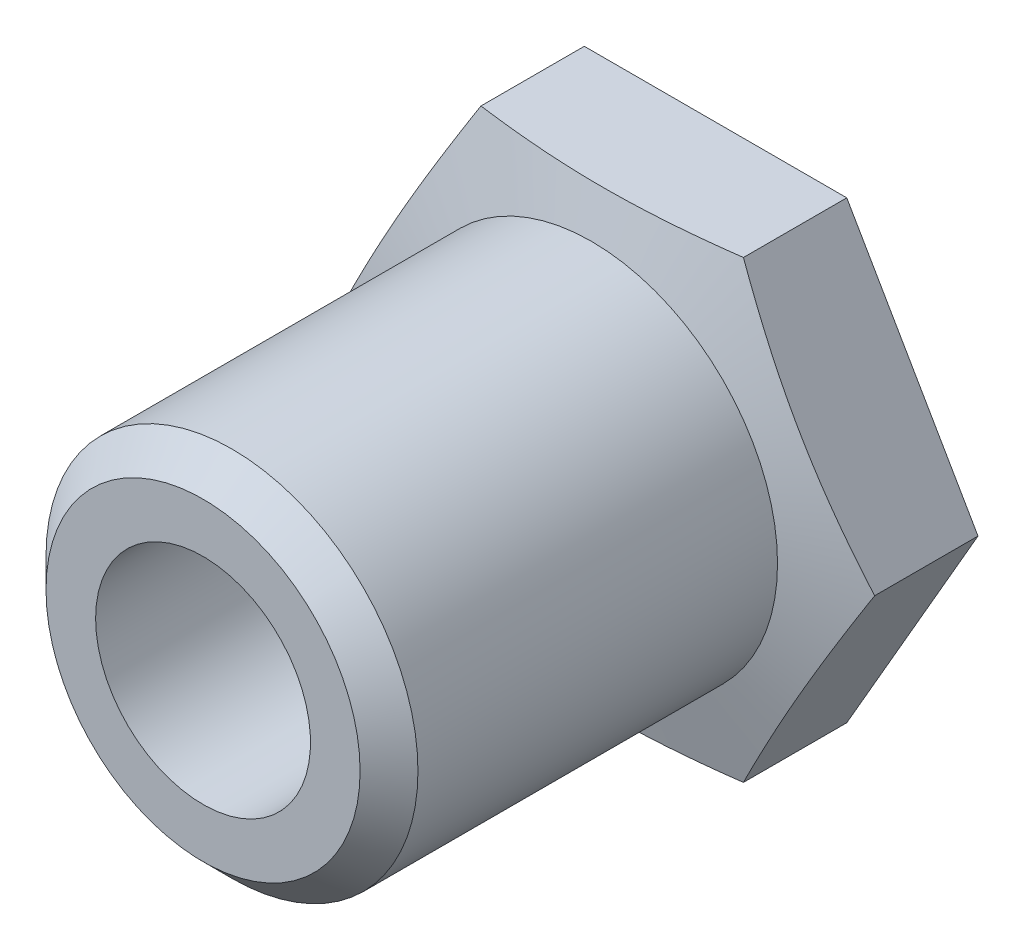
ISO-10303-21;
HEADER;
FILE_DESCRIPTION(('STEP AP214'),'2;1');
FILE_NAME('part.step','',(''),(''),'','','');
FILE_SCHEMA(('AUTOMOTIVE_DESIGN { 1 0 10303 214 1 1 1 1 }'));
ENDSEC;
DATA;
#1=APPLICATION_CONTEXT('core data for automotive mechanical design processes');
#2=APPLICATION_PROTOCOL_DEFINITION('international standard','automotive_design',2000,#1);
#3=PRODUCT_CONTEXT('',#1,'mechanical');
#4=PRODUCT('Part','Part','',(#3));
#5=PRODUCT_RELATED_PRODUCT_CATEGORY('part','',(#4));
#6=PRODUCT_DEFINITION_FORMATION('','',#4);
#7=PRODUCT_DEFINITION_CONTEXT('part definition',#1,'design');
#8=PRODUCT_DEFINITION('design','',#6,#7);
#9=PRODUCT_DEFINITION_SHAPE('','',#8);
#10=(LENGTH_UNIT() NAMED_UNIT(*) SI_UNIT(.MILLI.,.METRE.));
#11=(NAMED_UNIT(*) PLANE_ANGLE_UNIT() SI_UNIT($,.RADIAN.));
#12=(NAMED_UNIT(*) SI_UNIT($,.STERADIAN.) SOLID_ANGLE_UNIT());
#13=UNCERTAINTY_MEASURE_WITH_UNIT(LENGTH_MEASURE(1.E-05),#10,'distance_accuracy_value','');
#14=(GEOMETRIC_REPRESENTATION_CONTEXT(3) GLOBAL_UNCERTAINTY_ASSIGNED_CONTEXT((#13)) GLOBAL_UNIT_ASSIGNED_CONTEXT((#10,
#11,#12)) REPRESENTATION_CONTEXT('',''));
#15=CARTESIAN_POINT('',(0.,0.,0.));
#16=DIRECTION('',(0.,0.,1.));
#17=DIRECTION('',(1.,0.,0.));
#18=AXIS2_PLACEMENT_3D('',#15,#16,#17);
#19=CARTESIAN_POINT('',(0.,0.,12.4));
#20=DIRECTION('',(0.,0.,-1.));
#21=DIRECTION('',(-1.,0.,0.));
#22=AXIS2_PLACEMENT_3D('',#19,#20,#21);
#23=CYLINDRICAL_SURFACE('',#22,4.5);
#24=CARTESIAN_POINT('',(0.,0.,11.7));
#25=DIRECTION('',(0.,0.,1.));
#26=DIRECTION('',(1.,0.,0.));
#27=AXIS2_PLACEMENT_3D('',#24,#25,#26);
#28=CIRCLE('',#27,4.5);
#29=CARTESIAN_POINT('',(4.5,0.,11.7));
#30=VERTEX_POINT('',#29);
#31=EDGE_CURVE('E11',#30,#30,#28,.F.);
#32=ORIENTED_EDGE('',*,*,#31,.T.);
#33=EDGE_LOOP('',(#32));
#34=FACE_BOUND('',#33,.T.);
#35=CARTESIAN_POINT('',(0.,0.,3.));
#36=DIRECTION('',(0.,0.,1.));
#37=DIRECTION('',(1.,0.,0.));
#38=AXIS2_PLACEMENT_3D('',#35,#36,#37);
#39=CIRCLE('',#38,4.5);
#40=CARTESIAN_POINT('',(4.5,0.,3.));
#41=VERTEX_POINT('',#40);
#42=EDGE_CURVE('E225',#41,#41,#39,.T.);
#43=ORIENTED_EDGE('',*,*,#42,.T.);
#44=EDGE_LOOP('',(#43));
#45=FACE_BOUND('',#44,.T.);
#46=ADVANCED_FACE('F35',(#34,#45),#23,.T.);
#47=CARTESIAN_POINT('',(0.,0.,12.4));
#48=DIRECTION('',(0.,0.,1.));
#49=DIRECTION('',(1.,0.,0.));
#50=AXIS2_PLACEMENT_3D('',#47,#48,#49);
#51=PLANE('',#50);
#52=CARTESIAN_POINT('',(0.,0.,12.4));
#53=DIRECTION('',(0.,0.,1.));
#54=DIRECTION('',(1.,0.,0.));
#55=AXIS2_PLACEMENT_3D('',#52,#53,#54);
#56=CIRCLE('',#55,3.8);
#57=CARTESIAN_POINT('',(3.8,0.,12.4));
#58=VERTEX_POINT('',#57);
#59=EDGE_CURVE('E43',#58,#58,#56,.T.);
#60=ORIENTED_EDGE('',*,*,#59,.T.);
#61=EDGE_LOOP('',(#60));
#62=FACE_BOUND('',#61,.T.);
#63=CARTESIAN_POINT('',(0.,0.,12.4));
#64=DIRECTION('',(0.,0.,-1.));
#65=DIRECTION('',(-1.,0.,0.));
#66=AXIS2_PLACEMENT_3D('',#63,#64,#65);
#67=CIRCLE('',#66,2.6);
#68=CARTESIAN_POINT('',(-2.6,0.,12.4));
#69=VERTEX_POINT('',#68);
#70=EDGE_CURVE('E133',#69,#69,#67,.T.);
#71=ORIENTED_EDGE('',*,*,#70,.T.);
#72=EDGE_LOOP('',(#71));
#73=FACE_BOUND('',#72,.T.);
#74=ADVANCED_FACE('F192',(#62,#73),#51,.T.);
#75=CARTESIAN_POINT('',(0.,0.,12.4));
#76=DIRECTION('',(0.,0.,-1.));
#77=DIRECTION('',(-1.,0.,0.));
#78=AXIS2_PLACEMENT_3D('',#75,#76,#77);
#79=CYLINDRICAL_SURFACE('',#78,2.6);
#80=ORIENTED_EDGE('',*,*,#70,.F.);
#81=EDGE_LOOP('',(#80));
#82=FACE_BOUND('',#81,.T.);
#83=CARTESIAN_POINT('',(0.,0.,2.));
#84=DIRECTION('',(0.,0.,-1.));
#85=DIRECTION('',(-1.,0.,0.));
#86=AXIS2_PLACEMENT_3D('',#83,#84,#85);
#87=CIRCLE('',#86,2.6);
#88=CARTESIAN_POINT('',(-2.6,0.,2.));
#89=VERTEX_POINT('',#88);
#90=EDGE_CURVE('E94',#89,#89,#87,.T.);
#91=ORIENTED_EDGE('',*,*,#90,.T.);
#92=EDGE_LOOP('',(#91));
#93=FACE_BOUND('',#92,.T.);
#94=ADVANCED_FACE('F198',(#82,#93),#79,.F.);
#95=CARTESIAN_POINT('',(0.,0.,2.));
#96=DIRECTION('',(0.,0.,-1.));
#97=DIRECTION('',(-1.,0.,0.));
#98=AXIS2_PLACEMENT_3D('',#95,#96,#97);
#99=PLANE('',#98);
#100=ORIENTED_EDGE('',*,*,#90,.F.);
#101=EDGE_LOOP('',(#100));
#102=FACE_BOUND('',#101,.T.);
#103=ADVANCED_FACE('F151',(#102),#99,.F.);
#104=CARTESIAN_POINT('',(0.,0.,3.));
#105=DIRECTION('',(0.,0.,-1.));
#106=DIRECTION('',(-1.,0.,0.));
#107=AXIS2_PLACEMENT_3D('',#104,#105,#106);
#108=CONICAL_SURFACE('',#107,4.5,1.30694868141892);
#109=ORIENTED_EDGE('',*,*,#42,.F.);
#110=EDGE_LOOP('',(#109));
#111=FACE_BOUND('',#110,.T.);
#112=CARTESIAN_POINT('',(3.17531101048908,-5.50020000000003,2.49996880540881));
#113=CARTESIAN_POINT('',(3.30718086409633,-5.27179471356559,2.53560827067485));
#114=CARTESIAN_POINT('',(3.43929368472072,-5.04296859591292,2.56796434186975));
#115=CARTESIAN_POINT('',(3.70399356498637,-4.58449495453541,2.62481250126896));
#116=CARTESIAN_POINT('',(3.83658079778817,-4.35484713088773,2.64930133971248));
#117=CARTESIAN_POINT('',(4.10141249887106,-3.89614516915726,2.68898192793889));
#118=CARTESIAN_POINT('',(4.23365511710285,-3.66709423545387,2.70422177046429));
#119=CARTESIAN_POINT('',(4.49831175641597,-3.20869548960311,2.7246569593401));
#120=CARTESIAN_POINT('',(4.63072573861518,-2.97934774480156,2.7298542831265));
#121=CARTESIAN_POINT('',(4.8955537030136,-2.52065225519845,2.7298542831265));
#122=CARTESIAN_POINT('',(5.02796768521281,-2.2913045103969,2.7246569593401));
#123=CARTESIAN_POINT('',(5.29262432452594,-1.83290576454614,2.70422177046429));
#124=CARTESIAN_POINT('',(5.42486694275772,-1.60385483084275,2.68898192793889));
#125=CARTESIAN_POINT('',(5.68969864384062,-1.14515286911228,2.64930133971248));
#126=CARTESIAN_POINT('',(5.82228587664242,-0.915505045464597,2.62481250126896));
#127=CARTESIAN_POINT('',(6.08698575690807,-0.457031404087092,2.56796434186976));
#128=CARTESIAN_POINT('',(6.21909857753245,-0.228205286434417,2.53560827067485));
#129=CARTESIAN_POINT('',(6.35096843113971,0.000200000000016106,2.49996880540882));
#130=B_SPLINE_CURVE_WITH_KNOTS('',3,(#112,#113,#114,#115,#116,#117,#118,#119,#120,#121,#122,
#123,#124,#125,#126,#127,#128,#129),.UNSPECIFIED.,.F.,.F.,(4,2,2,2,2,2,2,2,4),(0.,
0.79845302802241,1.59723545457054,2.39182798445062,3.18626403804335,3.98070009163608,
4.77529262151615,5.57407504806429,6.3725280760867),.UNSPECIFIED.);
#131=CARTESIAN_POINT('',(3.17542648054298,-5.50000000000003,2.5));
#132=VERTEX_POINT('',#131);
#133=CARTESIAN_POINT('',(6.35085296108592,0.,2.5));
#134=VERTEX_POINT('',#133);
#135=EDGE_CURVE('E87',#132,#134,#130,.T.);
#136=ORIENTED_EDGE('',*,*,#135,.T.);
#137=CARTESIAN_POINT('',(6.35096843113971,-0.000199999999984875,2.49996880540882));
#138=CARTESIAN_POINT('',(6.21909857753245,0.228205286434449,2.53560827067485));
#139=CARTESIAN_POINT('',(6.08698575690806,0.457031404087123,2.56796434186976));
#140=CARTESIAN_POINT('',(5.82228587664241,0.915505045464627,2.62481250126896));
#141=CARTESIAN_POINT('',(5.68969864384061,1.14515286911231,2.64930133971248));
#142=CARTESIAN_POINT('',(5.42486694275772,1.60385483084277,2.68898192793889));
#143=CARTESIAN_POINT('',(5.29262432452593,1.83290576454616,2.70422177046429));
#144=CARTESIAN_POINT('',(5.0279676852128,2.29130451039693,2.7246569593401));
#145=CARTESIAN_POINT('',(4.89555370301359,2.52065225519848,2.7298542831265));
#146=CARTESIAN_POINT('',(4.63072573861517,2.97934774480158,2.7298542831265));
#147=CARTESIAN_POINT('',(4.49831175641596,3.20869548960314,2.7246569593401));
#148=CARTESIAN_POINT('',(4.23365511710284,3.6670942354539,2.70422177046428));
#149=CARTESIAN_POINT('',(4.10141249887105,3.89614516915729,2.68898192793888));
#150=CARTESIAN_POINT('',(3.83658079778815,4.35484713088776,2.64930133971247));
#151=CARTESIAN_POINT('',(3.70399356498635,4.58449495453544,2.62481250126896));
#152=CARTESIAN_POINT('',(3.4392936847207,5.04296859591294,2.56796434186975));
#153=CARTESIAN_POINT('',(3.30718086409631,5.27179471356561,2.53560827067484));
#154=CARTESIAN_POINT('',(3.17531101048906,5.50020000000005,2.49996880540881));
#155=B_SPLINE_CURVE_WITH_KNOTS('',3,(#137,#138,#139,#140,#141,#142,#143,#144,#145,#146,#147,
#148,#149,#150,#151,#152,#153,#154),.UNSPECIFIED.,.F.,.F.,(4,2,2,2,2,2,2,2,4),(0.,
0.798453028022411,1.59723545457054,2.39182798445062,3.18626403804335,3.98070009163608,
4.77529262151615,5.57407504806429,6.3725280760867),.UNSPECIFIED.);
#156=CARTESIAN_POINT('',(3.17542648054294,5.50000000000005,2.5));
#157=VERTEX_POINT('',#156);
#158=EDGE_CURVE('E90',#134,#157,#155,.T.);
#159=ORIENTED_EDGE('',*,*,#158,.T.);
#160=CARTESIAN_POINT('',(-8.37604764917882,5.50000000000005,1.50869084585545));
#161=CARTESIAN_POINT('',(-8.12680145019275,5.50000000000005,1.56495914991918));
#162=CARTESIAN_POINT('',(-7.87739624035822,5.50000000000005,1.62053578772309));
#163=CARTESIAN_POINT('',(-7.37818970420281,5.50000000000005,1.72993219848236));
#164=CARTESIAN_POINT('',(-7.12838836084236,5.50000000000005,1.78375189358873));
#165=CARTESIAN_POINT('',(-6.62808086018437,5.50000000000005,1.88930914543803));
#166=CARTESIAN_POINT('',(-6.37757424575021,5.50000000000005,1.9410445432589));
#167=CARTESIAN_POINT('',(-5.87602950686094,5.50000000000005,2.04186994899429));
#168=CARTESIAN_POINT('',(-5.62499138703514,5.50000000000005,2.09095997985181));
#169=CARTESIAN_POINT('',(-5.1243510925801,5.50000000000005,2.18547555450788));
#170=CARTESIAN_POINT('',(-4.8747539850863,5.50000000000005,2.23092780578391));
#171=CARTESIAN_POINT('',(-4.37486670922052,5.50000000000005,2.31783907452348));
#172=CARTESIAN_POINT('',(-4.12457655659067,5.50000000000005,2.35929818193585));
#173=CARTESIAN_POINT('',(-3.6232563207886,5.50000000000005,2.43728407256187));
#174=CARTESIAN_POINT('',(-3.37222634027827,5.50000000000005,2.47381150996572));
#175=CARTESIAN_POINT('',(-2.86935537269727,5.50000000000005,2.54085242863196));
#176=CARTESIAN_POINT('',(-2.61751438494814,5.50000000000005,2.571365904862));
#177=CARTESIAN_POINT('',(-2.11013760742528,5.50000000000005,2.62551391211825));
#178=CARTESIAN_POINT('',(-1.85459276068179,5.50000000000005,2.64906484304505));
#179=CARTESIAN_POINT('',(-1.34285532977526,5.50000000000005,2.68764901723002));
#180=CARTESIAN_POINT('',(-1.08666276091749,5.50000000000005,2.70268245989629));
#181=CARTESIAN_POINT('',(-0.5740079047183,5.50000000000005,2.72335257203808));
#182=CARTESIAN_POINT('',(-0.317545793347681,5.50000000000005,2.72899351786242));
#183=CARTESIAN_POINT('',(0.195408150510483,5.50000000000005,2.73053187554643));
#184=CARTESIAN_POINT('',(0.451899982987171,5.50000000000005,2.72642929095471));
#185=CARTESIAN_POINT('',(0.965509156636253,5.50000000000005,2.7087110378046));
#186=CARTESIAN_POINT('',(1.22262524669248,5.50000000000005,2.69505982707376));
#187=CARTESIAN_POINT('',(1.73623879652311,5.50000000000005,2.65902181815087));
#188=CARTESIAN_POINT('',(1.99273624231407,5.50000000000005,2.63663482432854));
#189=CARTESIAN_POINT('',(2.50511237094908,5.50000000000005,2.58425144800659));
#190=CARTESIAN_POINT('',(2.76099053216908,5.50000000000005,2.55425004111006));
#191=CARTESIAN_POINT('',(3.27191056340271,5.50000000000005,2.48788021733587));
#192=CARTESIAN_POINT('',(3.52695243099646,5.50000000000005,2.45151178205128));
#193=CARTESIAN_POINT('',(4.02090404693948,5.50000000000005,2.3759102253628));
#194=CARTESIAN_POINT('',(4.25986081942583,5.50000000000005,2.3369812829339));
#195=CARTESIAN_POINT('',(4.7371325388805,5.50000000000005,2.25535241820544));
#196=CARTESIAN_POINT('',(4.97544746766027,5.50000000000005,2.21265239017578));
#197=CARTESIAN_POINT('',(5.4515253927652,5.50000000000005,2.12417526713858));
#198=CARTESIAN_POINT('',(5.68928833617558,5.50000000000005,2.07839788878471));
#199=CARTESIAN_POINT('',(6.16431794625486,5.50000000000005,1.98433087059593));
#200=CARTESIAN_POINT('',(6.40158460634302,5.50000000000005,1.93604119766484));
#201=CARTESIAN_POINT('',(7.11285504480318,5.50000000000005,1.78808911835105));
#202=CARTESIAN_POINT('',(7.58622111316096,5.50000000000005,1.68536421558975));
#203=CARTESIAN_POINT('',(8.53167776173616,5.50000000000005,1.47438969598059));
#204=CARTESIAN_POINT('',(9.00376841673895,5.50000000000005,1.36614041080458));
#205=CARTESIAN_POINT('',(9.94222166980463,5.50000000000005,1.14687990319114));
#206=CARTESIAN_POINT('',(10.4085935229104,5.50000000000005,1.03590818449742));
#207=CARTESIAN_POINT('',(11.3406801840763,5.50000000000005,0.811209444707612));
#208=CARTESIAN_POINT('',(11.8063949796959,5.50000000000005,0.697482372163439));
#209=CARTESIAN_POINT('',(12.7367389906961,5.50000000000005,0.46813748105842));
#210=CARTESIAN_POINT('',(13.2013688351623,5.50000000000005,0.352522209350284));
#211=CARTESIAN_POINT('',(14.1302201586133,5.50000000000005,0.119727189775706));
#212=CARTESIAN_POINT('',(14.5944416507604,5.50000000000005,0.00254749446413092));
#213=CARTESIAN_POINT('',(15.0585209823323,5.50000000000005,-0.115185855876605));
#214=B_SPLINE_CURVE_WITH_KNOTS('',3,(#160,#161,#162,#163,#164,#165,#166,#167,#168,#169,#170,
#171,#172,#173,#174,#175,#176,#177,#178,#179,#180,#181,#182,#183,#184,#185,#186,#187,#188,#189,
#190,#191,#192,#193,#194,#195,#196,#197,#198,#199,#200,#201,#202,#203,#204,#205,#206,#207,#208,
#209,#210,#211,#212,#213),.UNSPECIFIED.,.F.,.F.,(4,2,2,2,2,2,2,2,2,2,2,2,2,2,2,2,2,2,2,2,2,2,2,
2,2,2,4),(0.,0.766559204635087,1.53315232903128,2.30052008367675,3.06788118194891,
3.82896078601792,4.59002324213275,5.35098464327108,6.11194668116364,6.88170562755361,
7.65144655190546,8.42083692179503,9.19022701147073,9.96249629346692,10.7347828707559,
11.5075803749602,12.280380113341,13.0066653942776,13.7329710445748,14.4593436611396,
15.1857258491315,16.638820490409,18.0918279934541,19.5299944417313,20.9681877642431,
22.404579562367,23.8409232275094),.UNSPECIFIED.);
#215=CARTESIAN_POINT('',(-3.17542648054296,5.50000000000003,2.5));
#216=VERTEX_POINT('',#215);
#217=EDGE_CURVE('E103',#157,#216,#214,.F.);
#218=ORIENTED_EDGE('',*,*,#217,.T.);
#219=CARTESIAN_POINT('',(-3.17531101048912,5.50020000000005,2.4999688054088));
#220=CARTESIAN_POINT('',(-3.30718086409637,5.27179471356561,2.53560827067484));
#221=CARTESIAN_POINT('',(-3.43929368472076,5.04296859591294,2.56796434186974));
#222=CARTESIAN_POINT('',(-3.70399356498641,4.58449495453543,2.62481250126895));
#223=CARTESIAN_POINT('',(-3.83658079778821,4.35484713088775,2.64930133971246));
#224=CARTESIAN_POINT('',(-4.10141249887111,3.89614516915728,2.68898192793887));
#225=CARTESIAN_POINT('',(-4.23365511710289,3.66709423545389,2.70422177046427));
#226=CARTESIAN_POINT('',(-4.49831175641602,3.20869548960313,2.72465695934009));
#227=CARTESIAN_POINT('',(-4.63072573861523,2.97934774480157,2.72985428312649));
#228=CARTESIAN_POINT('',(-4.89555370301365,2.52065225519847,2.72985428312649));
#229=CARTESIAN_POINT('',(-5.02796768521286,2.29130451039691,2.72465695934009));
#230=CARTESIAN_POINT('',(-5.29262432452598,1.83290576454615,2.70422177046427));
#231=CARTESIAN_POINT('',(-5.42486694275777,1.60385483084276,2.68898192793888));
#232=CARTESIAN_POINT('',(-5.68969864384067,1.14515286911229,2.64930133971247));
#233=CARTESIAN_POINT('',(-5.82228587664247,0.915505045464609,2.62481250126895));
#234=CARTESIAN_POINT('',(-6.08698575690812,0.457031404087103,2.56796434186974));
#235=CARTESIAN_POINT('',(-6.21909857753251,0.228205286434428,2.53560827067484));
#236=CARTESIAN_POINT('',(-6.35096843113976,-0.000200000000006428,2.49996880540881));
#237=B_SPLINE_CURVE_WITH_KNOTS('',3,(#219,#220,#221,#222,#223,#224,#225,#226,#227,#228,#229,
#230,#231,#232,#233,#234,#235,#236),.UNSPECIFIED.,.F.,.F.,(4,2,2,2,2,2,2,2,4),(0.,
0.798453028022412,1.59723545457055,2.39182798445062,3.18626403804336,3.98070009163609,
4.77529262151616,5.5740750480643,6.37252807608671),.UNSPECIFIED.);
#238=CARTESIAN_POINT('',(-6.35085296108592,0.,2.5));
#239=VERTEX_POINT('',#238);
#240=EDGE_CURVE('E171',#216,#239,#237,.T.);
#241=ORIENTED_EDGE('',*,*,#240,.T.);
#242=CARTESIAN_POINT('',(-6.35096843113976,0.000199999999991594,2.49996880540881));
#243=CARTESIAN_POINT('',(-6.21909857753251,-0.228205286434441,2.53560827067484));
#244=CARTESIAN_POINT('',(-6.08698575690812,-0.457031404087114,2.56796434186974));
#245=CARTESIAN_POINT('',(-5.82228587664247,-0.915505045464617,2.62481250126895));
#246=CARTESIAN_POINT('',(-5.68969864384067,-1.1451528691123,2.64930133971247));
#247=CARTESIAN_POINT('',(-5.42486694275777,-1.60385483084276,2.68898192793887));
#248=CARTESIAN_POINT('',(-5.29262432452599,-1.83290576454615,2.70422177046427));
#249=CARTESIAN_POINT('',(-5.02796768521286,-2.29130451039691,2.72465695934009));
#250=CARTESIAN_POINT('',(-4.89555370301365,-2.52065225519846,2.72985428312649));
#251=CARTESIAN_POINT('',(-4.63072573861523,-2.97934774480157,2.72985428312649));
#252=CARTESIAN_POINT('',(-4.49831175641602,-3.20869548960312,2.72465695934009));
#253=CARTESIAN_POINT('',(-4.2336551171029,-3.66709423545388,2.70422177046427));
#254=CARTESIAN_POINT('',(-4.10141249887111,-3.89614516915727,2.68898192793888));
#255=CARTESIAN_POINT('',(-3.83658079778821,-4.35484713088774,2.64930133971247));
#256=CARTESIAN_POINT('',(-3.70399356498641,-4.58449495453542,2.62481250126895));
#257=CARTESIAN_POINT('',(-3.43929368472076,-5.04296859591292,2.56796434186975));
#258=CARTESIAN_POINT('',(-3.30718086409638,-5.27179471356559,2.53560827067484));
#259=CARTESIAN_POINT('',(-3.17531101048912,-5.50020000000002,2.49996880540881));
#260=B_SPLINE_CURVE_WITH_KNOTS('',3,(#242,#243,#244,#245,#246,#247,#248,#249,#250,#251,#252,
#253,#254,#255,#256,#257,#258,#259),.UNSPECIFIED.,.F.,.F.,(4,2,2,2,2,2,2,2,4),(0.,
0.798453028022408,1.59723545457054,2.39182798445061,3.18626403804334,3.98070009163607,
4.77529262151614,5.57407504806427,6.37252807608668),.UNSPECIFIED.);
#261=CARTESIAN_POINT('',(-3.17542648054296,-5.50000000000003,2.5));
#262=VERTEX_POINT('',#261);
#263=EDGE_CURVE('E50',#239,#262,#260,.T.);
#264=ORIENTED_EDGE('',*,*,#263,.T.);
#265=CARTESIAN_POINT('',(-8.3760476491788,-5.50000000000003,1.50869084585546));
#266=CARTESIAN_POINT('',(-8.12680145019273,-5.50000000000003,1.56495914991918));
#267=CARTESIAN_POINT('',(-7.8773962403582,-5.50000000000003,1.6205357877231));
#268=CARTESIAN_POINT('',(-7.37818970420279,-5.50000000000003,1.72993219848237));
#269=CARTESIAN_POINT('',(-7.12838836084235,-5.50000000000003,1.78375189358874));
#270=CARTESIAN_POINT('',(-6.62808086018436,-5.50000000000003,1.88930914543804));
#271=CARTESIAN_POINT('',(-6.3775742457502,-5.50000000000003,1.9410445432589));
#272=CARTESIAN_POINT('',(-5.87602950686093,-5.50000000000003,2.04186994899429));
#273=CARTESIAN_POINT('',(-5.62499138703513,-5.50000000000003,2.09095997985182));
#274=CARTESIAN_POINT('',(-5.1243510925801,-5.50000000000003,2.18547555450788));
#275=CARTESIAN_POINT('',(-4.87475398508629,-5.50000000000003,2.23092780578392));
#276=CARTESIAN_POINT('',(-4.37486670922051,-5.50000000000003,2.31783907452348));
#277=CARTESIAN_POINT('',(-4.12457655659067,-5.50000000000003,2.35929818193585));
#278=CARTESIAN_POINT('',(-3.6232563207886,-5.50000000000003,2.43728407256188));
#279=CARTESIAN_POINT('',(-3.37222634027827,-5.50000000000003,2.47381150996572));
#280=CARTESIAN_POINT('',(-2.86935537269727,-5.50000000000003,2.54085242863197));
#281=CARTESIAN_POINT('',(-2.61751438494814,-5.50000000000003,2.57136590486201));
#282=CARTESIAN_POINT('',(-2.11013760742528,-5.50000000000003,2.62551391211826));
#283=CARTESIAN_POINT('',(-1.8545927606818,-5.50000000000003,2.64906484304505));
#284=CARTESIAN_POINT('',(-1.34285532977527,-5.50000000000003,2.68764901723003));
#285=CARTESIAN_POINT('',(-1.08666276091749,-5.50000000000003,2.7026824598963));
#286=CARTESIAN_POINT('',(-0.574007904718306,-5.50000000000003,2.72335257203809));
#287=CARTESIAN_POINT('',(-0.317545793347688,-5.50000000000003,2.72899351786243));
#288=CARTESIAN_POINT('',(0.195408150510474,-5.50000000000003,2.73053187554644));
#289=CARTESIAN_POINT('',(0.451899982987161,-5.50000000000003,2.72642929095472));
#290=CARTESIAN_POINT('',(0.965509156636243,-5.50000000000003,2.7087110378046));
#291=CARTESIAN_POINT('',(1.22262524669247,-5.50000000000003,2.69505982707376));
#292=CARTESIAN_POINT('',(1.7362387965231,-5.50000000000003,2.65902181815088));
#293=CARTESIAN_POINT('',(1.99273624231406,-5.50000000000003,2.63663482432855));
#294=CARTESIAN_POINT('',(2.50511237094906,-5.50000000000003,2.5842514480066));
#295=CARTESIAN_POINT('',(2.76099053216906,-5.50000000000003,2.55425004111007));
#296=CARTESIAN_POINT('',(3.27191056340269,-5.50000000000003,2.48788021733588));
#297=CARTESIAN_POINT('',(3.52695243099644,-5.50000000000003,2.45151178205129));
#298=CARTESIAN_POINT('',(4.02090404693946,-5.50000000000003,2.37591022536281));
#299=CARTESIAN_POINT('',(4.25986081942581,-5.50000000000003,2.33698128293391));
#300=CARTESIAN_POINT('',(4.73713253888049,-5.50000000000003,2.25535241820545));
#301=CARTESIAN_POINT('',(4.97544746766025,-5.50000000000003,2.21265239017579));
#302=CARTESIAN_POINT('',(5.45152539276518,-5.50000000000003,2.12417526713859));
#303=CARTESIAN_POINT('',(5.68928833617557,-5.50000000000003,2.07839788878472));
#304=CARTESIAN_POINT('',(6.16431794625485,-5.50000000000003,1.98433087059593));
#305=CARTESIAN_POINT('',(6.40158460634301,-5.50000000000003,1.93604119766485));
#306=CARTESIAN_POINT('',(7.11285504480317,-5.50000000000003,1.78808911835105));
#307=CARTESIAN_POINT('',(7.58622111316095,-5.50000000000003,1.68536421558976));
#308=CARTESIAN_POINT('',(8.53167776173615,-5.50000000000003,1.47438969598059));
#309=CARTESIAN_POINT('',(9.00376841673895,-5.50000000000003,1.36614041080458));
#310=CARTESIAN_POINT('',(9.94222166980463,-5.50000000000003,1.14687990319115));
#311=CARTESIAN_POINT('',(10.4085935229104,-5.50000000000003,1.03590818449742));
#312=CARTESIAN_POINT('',(11.3406801840763,-5.50000000000003,0.811209444707614));
#313=CARTESIAN_POINT('',(11.8063949796959,-5.50000000000003,0.697482372163441));
#314=CARTESIAN_POINT('',(12.7367389906961,-5.50000000000003,0.468137481058422));
#315=CARTESIAN_POINT('',(13.2013688351624,-5.50000000000003,0.352522209350285));
#316=CARTESIAN_POINT('',(14.1302201586133,-5.50000000000003,0.119727189775704));
#317=CARTESIAN_POINT('',(14.5944416507604,-5.50000000000003,0.00254749446412793));
#318=CARTESIAN_POINT('',(15.0585209823323,-5.50000000000003,-0.115185855876608));
#319=B_SPLINE_CURVE_WITH_KNOTS('',3,(#265,#266,#267,#268,#269,#270,#271,#272,#273,#274,#275,
#276,#277,#278,#279,#280,#281,#282,#283,#284,#285,#286,#287,#288,#289,#290,#291,#292,#293,#294,
#295,#296,#297,#298,#299,#300,#301,#302,#303,#304,#305,#306,#307,#308,#309,#310,#311,#312,#313,
#314,#315,#316,#317,#318),.UNSPECIFIED.,.F.,.F.,(4,2,2,2,2,2,2,2,2,2,2,2,2,2,2,2,2,2,2,2,2,2,2,
2,2,2,4),(0.,0.766559204635084,1.53315232903127,2.30052008367675,3.0678811819489,
3.82896078601791,4.59002324213274,5.35098464327107,6.11194668116362,6.88170562755359,
7.65144655190544,8.42083692179501,9.1902270114707,9.96249629346689,10.7347828707558,
11.5075803749601,12.2803801133409,13.0066653942775,13.7329710445747,14.4593436611395,
15.1857258491314,16.638820490409,18.0918279934541,19.5299944417312,20.968187764243,
22.404579562367,23.8409232275094),.UNSPECIFIED.);
#320=EDGE_CURVE('E92',#262,#132,#319,.T.);
#321=ORIENTED_EDGE('',*,*,#320,.T.);
#322=EDGE_LOOP('',(#136,#159,#218,#241,#264,#321));
#323=FACE_BOUND('',#322,.T.);
#324=ADVANCED_FACE('F89',(#111,#323),#108,.T.);
#325=CARTESIAN_POINT('',(6.35085296108587,0.,0.));
#326=DIRECTION('',(0.,0.,1.));
#327=DIRECTION('',(1.,0.,0.));
#328=AXIS2_PLACEMENT_3D('',#325,#326,#327);
#329=PLANE('',#328);
#330=DIRECTION('',(0.499999999999998,0.86602540378444,0.));
#331=VECTOR('',#330,1.);
#332=CARTESIAN_POINT('',(3.17542648054292,-5.50000000000003,0.));
#333=LINE('',#332,#331);
#334=CARTESIAN_POINT('',(3.17542648054292,-5.50000000000003,0.));
#335=VERTEX_POINT('',#334);
#336=CARTESIAN_POINT('',(6.35085296108587,0.,0.));
#337=VERTEX_POINT('',#336);
#338=EDGE_CURVE('E107',#335,#337,#333,.T.);
#339=ORIENTED_EDGE('',*,*,#338,.F.);
#340=DIRECTION('',(1.,0.,0.));
#341=VECTOR('',#340,1.);
#342=CARTESIAN_POINT('',(-3.17542648054296,-5.50000000000003,0.));
#343=LINE('',#342,#341);
#344=CARTESIAN_POINT('',(-3.17542648054296,-5.50000000000003,0.));
#345=VERTEX_POINT('',#344);
#346=EDGE_CURVE('E119',#345,#335,#343,.T.);
#347=ORIENTED_EDGE('',*,*,#346,.F.);
#348=DIRECTION('',(0.500000000000002,-0.866025403784438,0.));
#349=VECTOR('',#348,1.);
#350=CARTESIAN_POINT('',(-6.35085296108592,0.,0.));
#351=LINE('',#350,#349);
#352=CARTESIAN_POINT('',(-6.35085296108592,0.,0.));
#353=VERTEX_POINT('',#352);
#354=EDGE_CURVE('E121',#353,#345,#351,.T.);
#355=ORIENTED_EDGE('',*,*,#354,.F.);
#356=DIRECTION('',(-0.5,-0.866025403784439,0.));
#357=VECTOR('',#356,1.);
#358=CARTESIAN_POINT('',(-3.17542648054295,5.50000000000005,0.));
#359=LINE('',#358,#357);
#360=CARTESIAN_POINT('',(-3.17542648054295,5.50000000000005,0.));
#361=VERTEX_POINT('',#360);
#362=EDGE_CURVE('E124',#361,#353,#359,.T.);
#363=ORIENTED_EDGE('',*,*,#362,.F.);
#364=DIRECTION('',(-1.,0.,0.));
#365=VECTOR('',#364,1.);
#366=CARTESIAN_POINT('',(3.1754264805429,5.50000000000005,0.));
#367=LINE('',#366,#365);
#368=CARTESIAN_POINT('',(3.1754264805429,5.50000000000005,0.));
#369=VERTEX_POINT('',#368);
#370=EDGE_CURVE('E127',#369,#361,#367,.T.);
#371=ORIENTED_EDGE('',*,*,#370,.F.);
#372=DIRECTION('',(-0.500000000000001,0.866025403784438,0.));
#373=VECTOR('',#372,1.);
#374=CARTESIAN_POINT('',(6.35085296108587,0.,0.));
#375=LINE('',#374,#373);
#376=EDGE_CURVE('E130',#337,#369,#375,.T.);
#377=ORIENTED_EDGE('',*,*,#376,.F.);
#378=EDGE_LOOP('',(#339,#347,#355,#363,#371,#377));
#379=FACE_BOUND('',#378,.T.);
#380=ADVANCED_FACE('F150',(#379),#329,.F.);
#381=CARTESIAN_POINT('',(-3.17542648054296,-5.50000000000003,3.));
#382=DIRECTION('',(0.,1.,0.));
#383=DIRECTION('',(0.,0.,1.));
#384=AXIS2_PLACEMENT_3D('',#381,#382,#383);
#385=PLANE('',#384);
#386=ORIENTED_EDGE('',*,*,#320,.F.);
#387=DIRECTION('',(0.,0.,-1.));
#388=VECTOR('',#387,1.);
#389=CARTESIAN_POINT('',(-3.17542648054296,-5.50000000000003,3.));
#390=LINE('',#389,#388);
#391=EDGE_CURVE('E116',#262,#345,#390,.T.);
#392=ORIENTED_EDGE('',*,*,#391,.T.);
#393=ORIENTED_EDGE('',*,*,#346,.T.);
#394=DIRECTION('',(0.,0.,-1.));
#395=VECTOR('',#394,1.);
#396=CARTESIAN_POINT('',(3.17542648054292,-5.50000000000003,3.));
#397=LINE('',#396,#395);
#398=EDGE_CURVE('E58',#132,#335,#397,.T.);
#399=ORIENTED_EDGE('',*,*,#398,.F.);
#400=EDGE_LOOP('',(#386,#392,#393,#399));
#401=FACE_BOUND('',#400,.T.);
#402=ADVANCED_FACE('F204',(#401),#385,.F.);
#403=CARTESIAN_POINT('',(-6.35085296108592,0.,3.));
#404=DIRECTION('',(0.866025403784438,0.500000000000002,0.));
#405=DIRECTION('',(-0.500000000000002,0.866025403784438,0.));
#406=AXIS2_PLACEMENT_3D('',#403,#404,#405);
#407=PLANE('',#406);
#408=ORIENTED_EDGE('',*,*,#263,.F.);
#409=DIRECTION('',(0.,0.,-1.));
#410=VECTOR('',#409,1.);
#411=CARTESIAN_POINT('',(-6.35085296108592,0.,3.));
#412=LINE('',#411,#410);
#413=EDGE_CURVE('E114',#239,#353,#412,.T.);
#414=ORIENTED_EDGE('',*,*,#413,.T.);
#415=ORIENTED_EDGE('',*,*,#354,.T.);
#416=ORIENTED_EDGE('',*,*,#391,.F.);
#417=EDGE_LOOP('',(#408,#414,#415,#416));
#418=FACE_BOUND('',#417,.T.);
#419=ADVANCED_FACE('F208',(#418),#407,.F.);
#420=CARTESIAN_POINT('',(-3.17542648054295,5.50000000000005,3.));
#421=DIRECTION('',(0.866025403784439,-0.499999999999999,0.));
#422=DIRECTION('',(0.499999999999999,0.866025403784439,0.));
#423=AXIS2_PLACEMENT_3D('',#420,#421,#422);
#424=PLANE('',#423);
#425=ORIENTED_EDGE('',*,*,#240,.F.);
#426=DIRECTION('',(0.,0.,-1.));
#427=VECTOR('',#426,1.);
#428=CARTESIAN_POINT('',(-3.17542648054295,5.50000000000005,3.));
#429=LINE('',#428,#427);
#430=EDGE_CURVE('E110',#216,#361,#429,.T.);
#431=ORIENTED_EDGE('',*,*,#430,.T.);
#432=ORIENTED_EDGE('',*,*,#362,.T.);
#433=ORIENTED_EDGE('',*,*,#413,.F.);
#434=EDGE_LOOP('',(#425,#431,#432,#433));
#435=FACE_BOUND('',#434,.T.);
#436=ADVANCED_FACE('F183',(#435),#424,.F.);
#437=CARTESIAN_POINT('',(3.1754264805429,5.50000000000005,3.));
#438=DIRECTION('',(0.,-1.,0.));
#439=DIRECTION('',(0.,0.,-1.));
#440=AXIS2_PLACEMENT_3D('',#437,#438,#439);
#441=PLANE('',#440);
#442=ORIENTED_EDGE('',*,*,#217,.F.);
#443=DIRECTION('',(0.,0.,-1.));
#444=VECTOR('',#443,1.);
#445=CARTESIAN_POINT('',(3.1754264805429,5.50000000000005,3.));
#446=LINE('',#445,#444);
#447=EDGE_CURVE('E102',#157,#369,#446,.T.);
#448=ORIENTED_EDGE('',*,*,#447,.T.);
#449=ORIENTED_EDGE('',*,*,#370,.T.);
#450=ORIENTED_EDGE('',*,*,#430,.F.);
#451=EDGE_LOOP('',(#442,#448,#449,#450));
#452=FACE_BOUND('',#451,.T.);
#453=ADVANCED_FACE('F180',(#452),#441,.F.);
#454=CARTESIAN_POINT('',(6.35085296108587,0.,3.));
#455=DIRECTION('',(-0.866025403784438,-0.500000000000001,0.));
#456=DIRECTION('',(0.500000000000001,-0.866025403784438,0.));
#457=AXIS2_PLACEMENT_3D('',#454,#455,#456);
#458=PLANE('',#457);
#459=ORIENTED_EDGE('',*,*,#158,.F.);
#460=DIRECTION('',(0.,0.,-1.));
#461=VECTOR('',#460,1.);
#462=CARTESIAN_POINT('',(6.35085296108587,0.,3.));
#463=LINE('',#462,#461);
#464=EDGE_CURVE('E100',#134,#337,#463,.T.);
#465=ORIENTED_EDGE('',*,*,#464,.T.);
#466=ORIENTED_EDGE('',*,*,#376,.T.);
#467=ORIENTED_EDGE('',*,*,#447,.F.);
#468=EDGE_LOOP('',(#459,#465,#466,#467));
#469=FACE_BOUND('',#468,.T.);
#470=ADVANCED_FACE('F98',(#469),#458,.F.);
#471=CARTESIAN_POINT('',(3.17542648054292,-5.50000000000003,3.));
#472=DIRECTION('',(-0.86602540378444,0.499999999999998,0.));
#473=DIRECTION('',(-0.499999999999998,-0.86602540378444,0.));
#474=AXIS2_PLACEMENT_3D('',#471,#472,#473);
#475=PLANE('',#474);
#476=ORIENTED_EDGE('',*,*,#135,.F.);
#477=ORIENTED_EDGE('',*,*,#398,.T.);
#478=ORIENTED_EDGE('',*,*,#338,.T.);
#479=ORIENTED_EDGE('',*,*,#464,.F.);
#480=EDGE_LOOP('',(#476,#477,#478,#479));
#481=FACE_BOUND('',#480,.T.);
#482=ADVANCED_FACE('F105',(#481),#475,.F.);
#483=CARTESIAN_POINT('',(0.,0.,12.4));
#484=DIRECTION('',(0.,0.,-1.));
#485=DIRECTION('',(-1.,0.,0.));
#486=AXIS2_PLACEMENT_3D('',#483,#484,#485);
#487=CONICAL_SURFACE('',#486,3.8,0.785398163397446);
#488=ORIENTED_EDGE('',*,*,#31,.F.);
#489=EDGE_LOOP('',(#488));
#490=FACE_BOUND('',#489,.T.);
#491=ORIENTED_EDGE('',*,*,#59,.F.);
#492=EDGE_LOOP('',(#491));
#493=FACE_BOUND('',#492,.T.);
#494=ADVANCED_FACE('F37',(#490,#493),#487,.T.);
#495=CLOSED_SHELL('',(#46,#74,#94,#103,#324,#380,#402,#419,#436,#453,#470,#482,#494));
#496=MANIFOLD_SOLID_BREP('B2',#495);
#497=ADVANCED_BREP_SHAPE_REPRESENTATION('',(#18,#496),#14);
#498=SHAPE_DEFINITION_REPRESENTATION(#9,#497);
ENDSEC;
END-ISO-10303-21;
